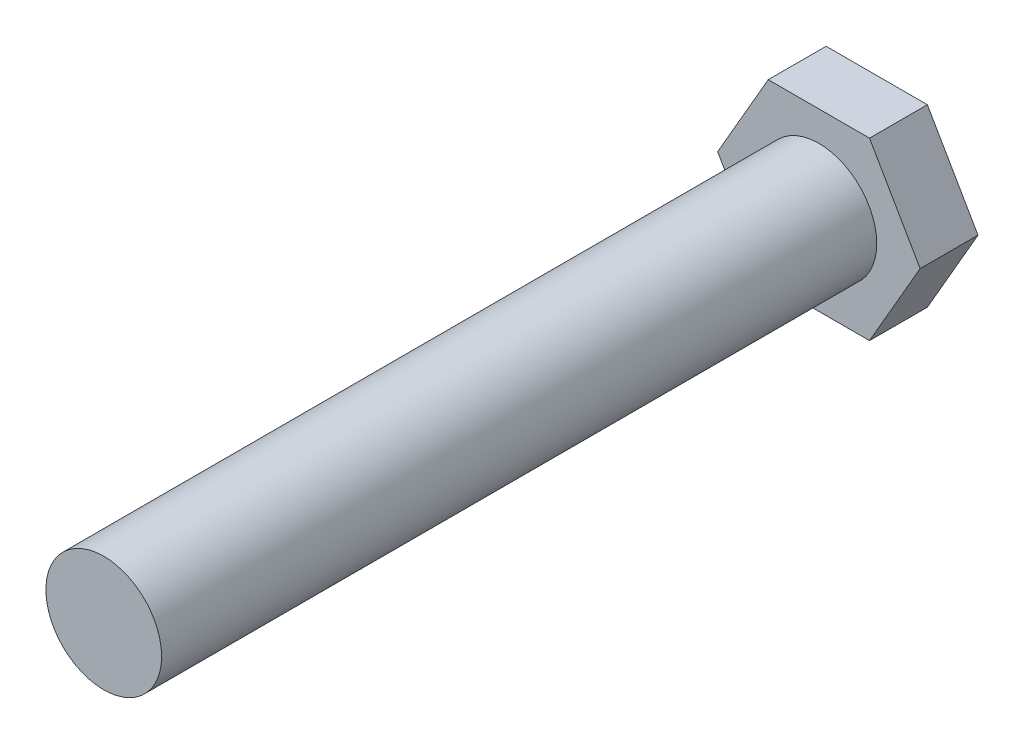
ISO-10303-21;
HEADER;
FILE_DESCRIPTION(('STEP AP214'),'2;1');
FILE_NAME('part.step','',(''),(''),'','','');
FILE_SCHEMA(('AUTOMOTIVE_DESIGN { 1 0 10303 214 1 1 1 1 }'));
ENDSEC;
DATA;
#1=APPLICATION_CONTEXT('core data for automotive mechanical design processes');
#2=APPLICATION_PROTOCOL_DEFINITION('international standard','automotive_design',2000,#1);
#3=PRODUCT_CONTEXT('',#1,'mechanical');
#4=PRODUCT('Part','Part','',(#3));
#5=PRODUCT_RELATED_PRODUCT_CATEGORY('part','',(#4));
#6=PRODUCT_DEFINITION_FORMATION('','',#4);
#7=PRODUCT_DEFINITION_CONTEXT('part definition',#1,'design');
#8=PRODUCT_DEFINITION('design','',#6,#7);
#9=PRODUCT_DEFINITION_SHAPE('','',#8);
#10=(LENGTH_UNIT() NAMED_UNIT(*) SI_UNIT(.MILLI.,.METRE.));
#11=(NAMED_UNIT(*) PLANE_ANGLE_UNIT() SI_UNIT($,.RADIAN.));
#12=(NAMED_UNIT(*) SI_UNIT($,.STERADIAN.) SOLID_ANGLE_UNIT());
#13=UNCERTAINTY_MEASURE_WITH_UNIT(LENGTH_MEASURE(1.E-05),#10,'distance_accuracy_value','');
#14=(GEOMETRIC_REPRESENTATION_CONTEXT(3) GLOBAL_UNCERTAINTY_ASSIGNED_CONTEXT((#13)) GLOBAL_UNIT_ASSIGNED_CONTEXT((#10,
#11,#12)) REPRESENTATION_CONTEXT('',''));
#15=CARTESIAN_POINT('',(0.,0.,0.));
#16=DIRECTION('',(0.,0.,1.));
#17=DIRECTION('',(1.,0.,0.));
#18=AXIS2_PLACEMENT_3D('',#15,#16,#17);
#19=CARTESIAN_POINT('',(22.225,0.,12.7));
#20=DIRECTION('',(0.,0.,1.));
#21=DIRECTION('',(1.,0.,0.));
#22=AXIS2_PLACEMENT_3D('',#19,#20,#21);
#23=PLANE('',#22);
#24=DIRECTION('',(0.5,0.866025403784439,0.));
#25=VECTOR('',#24,1.);
#26=CARTESIAN_POINT('',(11.1125,-19.2474145991091,12.7));
#27=LINE('',#26,#25);
#28=CARTESIAN_POINT('',(11.1125,-19.2474145991091,12.7));
#29=VERTEX_POINT('',#28);
#30=CARTESIAN_POINT('',(22.225,0.,12.7));
#31=VERTEX_POINT('',#30);
#32=EDGE_CURVE('E129',#29,#31,#27,.T.);
#33=ORIENTED_EDGE('',*,*,#32,.T.);
#34=DIRECTION('',(-0.5,0.866025403784438,0.));
#35=VECTOR('',#34,1.);
#36=CARTESIAN_POINT('',(22.225,0.,12.7));
#37=LINE('',#36,#35);
#38=CARTESIAN_POINT('',(11.1125,19.2474145991091,12.7));
#39=VERTEX_POINT('',#38);
#40=EDGE_CURVE('E87',#31,#39,#37,.T.);
#41=ORIENTED_EDGE('',*,*,#40,.T.);
#42=DIRECTION('',(-1.,0.,0.));
#43=VECTOR('',#42,1.);
#44=CARTESIAN_POINT('',(11.1125,19.2474145991091,12.7));
#45=LINE('',#44,#43);
#46=CARTESIAN_POINT('',(-11.1125,19.2474145991091,12.7));
#47=VERTEX_POINT('',#46);
#48=EDGE_CURVE('E100',#39,#47,#45,.T.);
#49=ORIENTED_EDGE('',*,*,#48,.T.);
#50=DIRECTION('',(-0.5,-0.866025403784438,0.));
#51=VECTOR('',#50,1.);
#52=CARTESIAN_POINT('',(-11.1125,19.2474145991091,12.7));
#53=LINE('',#52,#51);
#54=CARTESIAN_POINT('',(-22.225,0.,12.7));
#55=VERTEX_POINT('',#54);
#56=EDGE_CURVE('E94',#47,#55,#53,.T.);
#57=ORIENTED_EDGE('',*,*,#56,.T.);
#58=DIRECTION('',(0.5,-0.866025403784438,0.));
#59=VECTOR('',#58,1.);
#60=CARTESIAN_POINT('',(-22.225,0.,12.7));
#61=LINE('',#60,#59);
#62=CARTESIAN_POINT('',(-11.1125,-19.2474145991091,12.7));
#63=VERTEX_POINT('',#62);
#64=EDGE_CURVE('E98',#55,#63,#61,.T.);
#65=ORIENTED_EDGE('',*,*,#64,.T.);
#66=DIRECTION('',(1.,0.,0.));
#67=VECTOR('',#66,1.);
#68=CARTESIAN_POINT('',(-11.1125,-19.2474145991091,12.7));
#69=LINE('',#68,#67);
#70=EDGE_CURVE('E50',#63,#29,#69,.T.);
#71=ORIENTED_EDGE('',*,*,#70,.T.);
#72=EDGE_LOOP('',(#33,#41,#49,#57,#65,#71));
#73=FACE_BOUND('',#72,.T.);
#74=CARTESIAN_POINT('',(0.,0.,12.7));
#75=DIRECTION('',(0.,0.,1.));
#76=DIRECTION('',(1.,0.,0.));
#77=AXIS2_PLACEMENT_3D('',#74,#75,#76);
#78=CIRCLE('',#77,12.7);
#79=CARTESIAN_POINT('',(12.7,0.,12.7));
#80=VERTEX_POINT('',#79);
#81=EDGE_CURVE('E169',#80,#80,#78,.T.);
#82=ORIENTED_EDGE('',*,*,#81,.F.);
#83=EDGE_LOOP('',(#82));
#84=FACE_BOUND('',#83,.T.);
#85=ADVANCED_FACE('F33',(#73,#84),#23,.T.);
#86=CARTESIAN_POINT('',(11.1125,-19.2474145991091,12.7));
#87=DIRECTION('',(-0.866025403784439,0.5,0.));
#88=DIRECTION('',(-0.5,-0.866025403784439,0.));
#89=AXIS2_PLACEMENT_3D('',#86,#87,#88);
#90=PLANE('',#89);
#91=DIRECTION('',(0.5,0.866025403784439,0.));
#92=VECTOR('',#91,1.);
#93=CARTESIAN_POINT('',(11.1125,-19.2474145991091,0.));
#94=LINE('',#93,#92);
#95=CARTESIAN_POINT('',(11.1125,-19.2474145991091,0.));
#96=VERTEX_POINT('',#95);
#97=CARTESIAN_POINT('',(22.225,0.,0.));
#98=VERTEX_POINT('',#97);
#99=EDGE_CURVE('E118',#96,#98,#94,.T.);
#100=ORIENTED_EDGE('',*,*,#99,.T.);
#101=DIRECTION('',(0.,0.,-1.));
#102=VECTOR('',#101,1.);
#103=CARTESIAN_POINT('',(22.225,0.,12.7));
#104=LINE('',#103,#102);
#105=EDGE_CURVE('E11',#31,#98,#104,.T.);
#106=ORIENTED_EDGE('',*,*,#105,.F.);
#107=ORIENTED_EDGE('',*,*,#32,.F.);
#108=DIRECTION('',(0.,0.,-1.));
#109=VECTOR('',#108,1.);
#110=CARTESIAN_POINT('',(11.1125,-19.2474145991091,12.7));
#111=LINE('',#110,#109);
#112=EDGE_CURVE('E114',#29,#96,#111,.T.);
#113=ORIENTED_EDGE('',*,*,#112,.T.);
#114=EDGE_LOOP('',(#100,#106,#107,#113));
#115=FACE_BOUND('',#114,.T.);
#116=ADVANCED_FACE('F35',(#115),#90,.F.);
#117=CARTESIAN_POINT('',(22.225,0.,12.7));
#118=DIRECTION('',(-0.866025403784438,-0.5,0.));
#119=DIRECTION('',(0.5,-0.866025403784438,0.));
#120=AXIS2_PLACEMENT_3D('',#117,#118,#119);
#121=PLANE('',#120);
#122=DIRECTION('',(-0.5,0.866025403784438,0.));
#123=VECTOR('',#122,1.);
#124=CARTESIAN_POINT('',(22.225,0.,0.));
#125=LINE('',#124,#123);
#126=CARTESIAN_POINT('',(11.1125,19.2474145991091,0.));
#127=VERTEX_POINT('',#126);
#128=EDGE_CURVE('E121',#98,#127,#125,.T.);
#129=ORIENTED_EDGE('',*,*,#128,.T.);
#130=DIRECTION('',(0.,0.,-1.));
#131=VECTOR('',#130,1.);
#132=CARTESIAN_POINT('',(11.1125,19.2474145991091,12.7));
#133=LINE('',#132,#131);
#134=EDGE_CURVE('E42',#39,#127,#133,.T.);
#135=ORIENTED_EDGE('',*,*,#134,.F.);
#136=ORIENTED_EDGE('',*,*,#40,.F.);
#137=ORIENTED_EDGE('',*,*,#105,.T.);
#138=EDGE_LOOP('',(#129,#135,#136,#137));
#139=FACE_BOUND('',#138,.T.);
#140=ADVANCED_FACE('F157',(#139),#121,.F.);
#141=CARTESIAN_POINT('',(11.1125,19.2474145991091,12.7));
#142=DIRECTION('',(0.,-1.,0.));
#143=DIRECTION('',(0.,0.,-1.));
#144=AXIS2_PLACEMENT_3D('',#141,#142,#143);
#145=PLANE('',#144);
#146=DIRECTION('',(-1.,0.,0.));
#147=VECTOR('',#146,1.);
#148=CARTESIAN_POINT('',(11.1125,19.2474145991091,0.));
#149=LINE('',#148,#147);
#150=CARTESIAN_POINT('',(-11.1125,19.2474145991091,0.));
#151=VERTEX_POINT('',#150);
#152=EDGE_CURVE('E124',#127,#151,#149,.T.);
#153=ORIENTED_EDGE('',*,*,#152,.T.);
#154=DIRECTION('',(0.,0.,-1.));
#155=VECTOR('',#154,1.);
#156=CARTESIAN_POINT('',(-11.1125,19.2474145991091,12.7));
#157=LINE('',#156,#155);
#158=EDGE_CURVE('E109',#47,#151,#157,.T.);
#159=ORIENTED_EDGE('',*,*,#158,.F.);
#160=ORIENTED_EDGE('',*,*,#48,.F.);
#161=ORIENTED_EDGE('',*,*,#134,.T.);
#162=EDGE_LOOP('',(#153,#159,#160,#161));
#163=FACE_BOUND('',#162,.T.);
#164=ADVANCED_FACE('F135',(#163),#145,.F.);
#165=CARTESIAN_POINT('',(-11.1125,19.2474145991091,12.7));
#166=DIRECTION('',(0.866025403784439,-0.5,0.));
#167=DIRECTION('',(0.5,0.866025403784439,0.));
#168=AXIS2_PLACEMENT_3D('',#165,#166,#167);
#169=PLANE('',#168);
#170=DIRECTION('',(-0.5,-0.866025403784438,0.));
#171=VECTOR('',#170,1.);
#172=CARTESIAN_POINT('',(-11.1125,19.2474145991091,0.));
#173=LINE('',#172,#171);
#174=CARTESIAN_POINT('',(-22.225,0.,0.));
#175=VERTEX_POINT('',#174);
#176=EDGE_CURVE('E108',#151,#175,#173,.T.);
#177=ORIENTED_EDGE('',*,*,#176,.T.);
#178=DIRECTION('',(0.,0.,-1.));
#179=VECTOR('',#178,1.);
#180=CARTESIAN_POINT('',(-22.225,0.,12.7));
#181=LINE('',#180,#179);
#182=EDGE_CURVE('E105',#55,#175,#181,.T.);
#183=ORIENTED_EDGE('',*,*,#182,.F.);
#184=ORIENTED_EDGE('',*,*,#56,.F.);
#185=ORIENTED_EDGE('',*,*,#158,.T.);
#186=EDGE_LOOP('',(#177,#183,#184,#185));
#187=FACE_BOUND('',#186,.T.);
#188=ADVANCED_FACE('F106',(#187),#169,.F.);
#189=CARTESIAN_POINT('',(-22.225,0.,12.7));
#190=DIRECTION('',(0.866025403784438,0.5,0.));
#191=DIRECTION('',(-0.5,0.866025403784439,0.));
#192=AXIS2_PLACEMENT_3D('',#189,#190,#191);
#193=PLANE('',#192);
#194=DIRECTION('',(0.5,-0.866025403784438,0.));
#195=VECTOR('',#194,1.);
#196=CARTESIAN_POINT('',(-22.225,0.,0.));
#197=LINE('',#196,#195);
#198=CARTESIAN_POINT('',(-11.1125,-19.2474145991091,0.));
#199=VERTEX_POINT('',#198);
#200=EDGE_CURVE('E73',#175,#199,#197,.T.);
#201=ORIENTED_EDGE('',*,*,#200,.T.);
#202=DIRECTION('',(0.,0.,-1.));
#203=VECTOR('',#202,1.);
#204=CARTESIAN_POINT('',(-11.1125,-19.2474145991091,12.7));
#205=LINE('',#204,#203);
#206=EDGE_CURVE('E110',#63,#199,#205,.T.);
#207=ORIENTED_EDGE('',*,*,#206,.F.);
#208=ORIENTED_EDGE('',*,*,#64,.F.);
#209=ORIENTED_EDGE('',*,*,#182,.T.);
#210=EDGE_LOOP('',(#201,#207,#208,#209));
#211=FACE_BOUND('',#210,.T.);
#212=ADVANCED_FACE('F112',(#211),#193,.F.);
#213=CARTESIAN_POINT('',(-11.1125,-19.2474145991091,12.7));
#214=DIRECTION('',(0.,1.,0.));
#215=DIRECTION('',(0.,0.,1.));
#216=AXIS2_PLACEMENT_3D('',#213,#214,#215);
#217=PLANE('',#216);
#218=DIRECTION('',(1.,0.,0.));
#219=VECTOR('',#218,1.);
#220=CARTESIAN_POINT('',(-11.1125,-19.2474145991091,0.));
#221=LINE('',#220,#219);
#222=EDGE_CURVE('E79',#199,#96,#221,.T.);
#223=ORIENTED_EDGE('',*,*,#222,.T.);
#224=ORIENTED_EDGE('',*,*,#112,.F.);
#225=ORIENTED_EDGE('',*,*,#70,.F.);
#226=ORIENTED_EDGE('',*,*,#206,.T.);
#227=EDGE_LOOP('',(#223,#224,#225,#226));
#228=FACE_BOUND('',#227,.T.);
#229=ADVANCED_FACE('F142',(#228),#217,.F.);
#230=CARTESIAN_POINT('',(22.225,0.,0.));
#231=DIRECTION('',(0.,0.,1.));
#232=DIRECTION('',(1.,0.,0.));
#233=AXIS2_PLACEMENT_3D('',#230,#231,#232);
#234=PLANE('',#233);
#235=ORIENTED_EDGE('',*,*,#99,.F.);
#236=ORIENTED_EDGE('',*,*,#222,.F.);
#237=ORIENTED_EDGE('',*,*,#200,.F.);
#238=ORIENTED_EDGE('',*,*,#176,.F.);
#239=ORIENTED_EDGE('',*,*,#152,.F.);
#240=ORIENTED_EDGE('',*,*,#128,.F.);
#241=EDGE_LOOP('',(#235,#236,#237,#238,#239,#240));
#242=FACE_BOUND('',#241,.T.);
#243=ADVANCED_FACE('F138',(#242),#234,.F.);
#244=CARTESIAN_POINT('',(0.,0.,169.672));
#245=DIRECTION('',(0.,0.,-1.));
#246=DIRECTION('',(-1.,0.,0.));
#247=AXIS2_PLACEMENT_3D('',#244,#245,#246);
#248=CYLINDRICAL_SURFACE('',#247,12.7);
#249=CARTESIAN_POINT('',(0.,0.,169.672));
#250=DIRECTION('',(0.,0.,1.));
#251=DIRECTION('',(1.,0.,0.));
#252=AXIS2_PLACEMENT_3D('',#249,#250,#251);
#253=CIRCLE('',#252,12.7);
#254=CARTESIAN_POINT('',(12.7,0.,169.672));
#255=VERTEX_POINT('',#254);
#256=EDGE_CURVE('E122',#255,#255,#253,.T.);
#257=ORIENTED_EDGE('',*,*,#256,.F.);
#258=EDGE_LOOP('',(#257));
#259=FACE_BOUND('',#258,.T.);
#260=ORIENTED_EDGE('',*,*,#81,.T.);
#261=EDGE_LOOP('',(#260));
#262=FACE_BOUND('',#261,.T.);
#263=ADVANCED_FACE('F149',(#259,#262),#248,.T.);
#264=CARTESIAN_POINT('',(0.,0.,169.672));
#265=DIRECTION('',(0.,0.,1.));
#266=DIRECTION('',(1.,0.,0.));
#267=AXIS2_PLACEMENT_3D('',#264,#265,#266);
#268=PLANE('',#267);
#269=ORIENTED_EDGE('',*,*,#256,.T.);
#270=EDGE_LOOP('',(#269));
#271=FACE_BOUND('',#270,.T.);
#272=ADVANCED_FACE('F161',(#271),#268,.T.);
#273=CLOSED_SHELL('',(#85,#116,#140,#164,#188,#212,#229,#243,#263,#272));
#274=MANIFOLD_SOLID_BREP('B2',#273);
#275=ADVANCED_BREP_SHAPE_REPRESENTATION('',(#18,#274),#14);
#276=SHAPE_DEFINITION_REPRESENTATION(#9,#275);
ENDSEC;
END-ISO-10303-21;
